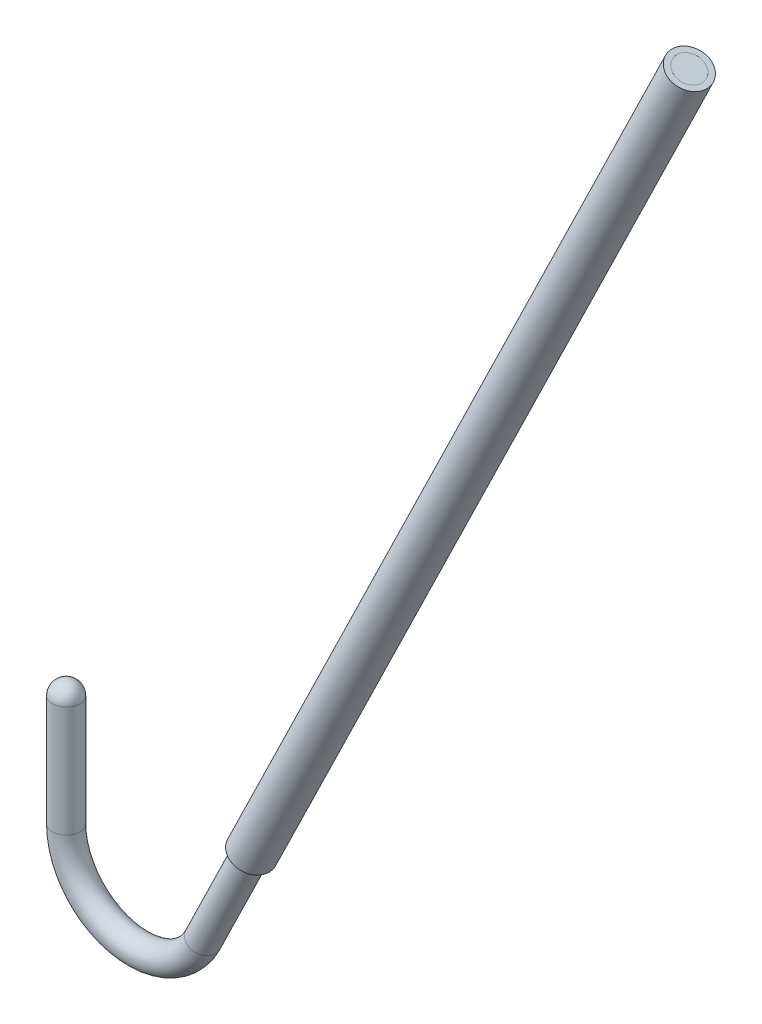
ISO-10303-21;
HEADER;
FILE_DESCRIPTION(('STEP AP214'),'2;1');
FILE_NAME('part.step','',(''),(''),'','','');
FILE_SCHEMA(('AUTOMOTIVE_DESIGN { 1 0 10303 214 1 1 1 1 }'));
ENDSEC;
DATA;
#1=APPLICATION_CONTEXT('core data for automotive mechanical design processes');
#2=APPLICATION_PROTOCOL_DEFINITION('international standard','automotive_design',2000,#1);
#3=PRODUCT_CONTEXT('',#1,'mechanical');
#4=PRODUCT('Part','Part','',(#3));
#5=PRODUCT_RELATED_PRODUCT_CATEGORY('part','',(#4));
#6=PRODUCT_DEFINITION_FORMATION('','',#4);
#7=PRODUCT_DEFINITION_CONTEXT('part definition',#1,'design');
#8=PRODUCT_DEFINITION('design','',#6,#7);
#9=PRODUCT_DEFINITION_SHAPE('','',#8);
#10=(LENGTH_UNIT() NAMED_UNIT(*) SI_UNIT(.MILLI.,.METRE.));
#11=(NAMED_UNIT(*) PLANE_ANGLE_UNIT() SI_UNIT($,.RADIAN.));
#12=(NAMED_UNIT(*) SI_UNIT($,.STERADIAN.) SOLID_ANGLE_UNIT());
#13=UNCERTAINTY_MEASURE_WITH_UNIT(LENGTH_MEASURE(1.E-05),#10,'distance_accuracy_value','');
#14=(GEOMETRIC_REPRESENTATION_CONTEXT(3) GLOBAL_UNCERTAINTY_ASSIGNED_CONTEXT((#13)) GLOBAL_UNIT_ASSIGNED_CONTEXT((#10,
#11,#12)) REPRESENTATION_CONTEXT('',''));
#15=CARTESIAN_POINT('',(0.,0.,0.));
#16=DIRECTION('',(0.,0.,1.));
#17=DIRECTION('',(1.,0.,0.));
#18=AXIS2_PLACEMENT_3D('',#15,#16,#17);
#19=CARTESIAN_POINT('',(3.34517455376707,-0.772294398227437,0.));
#20=DIRECTION('',(0.438371146789072,0.89879404629917,0.));
#21=DIRECTION('',(-0.89879404629917,0.438371146789072,0.));
#22=AXIS2_PLACEMENT_3D('',#19,#20,#21);
#23=CYLINDRICAL_SURFACE('',#22,0.35);
#24=CARTESIAN_POINT('',(3.34517455376707,-0.772294398227437,0.));
#25=DIRECTION('',(0.438371146789072,0.89879404629917,0.));
#26=DIRECTION('',(-0.89879404629917,0.438371146789072,0.));
#27=AXIS2_PLACEMENT_3D('',#24,#25,#26);
#28=CIRCLE('',#27,0.35);
#29=CARTESIAN_POINT('',(3.03059663756236,-0.618864496851262,0.));
#30=VERTEX_POINT('',#29);
#31=EDGE_CURVE('E11',#30,#30,#28,.T.);
#32=ORIENTED_EDGE('',*,*,#31,.T.);
#33=EDGE_LOOP('',(#32));
#34=FACE_BOUND('',#33,.T.);
#35=CARTESIAN_POINT('',(11.2358551959704,15.4059984351576,0.));
#36=DIRECTION('',(0.438371146789072,0.89879404629917,0.));
#37=DIRECTION('',(-0.89879404629917,0.438371146789072,0.));
#38=AXIS2_PLACEMENT_3D('',#35,#36,#37);
#39=CIRCLE('',#38,0.35);
#40=CARTESIAN_POINT('',(10.9212772797657,15.5594283365338,0.));
#41=VERTEX_POINT('',#40);
#42=EDGE_CURVE('E45',#41,#41,#39,.T.);
#43=ORIENTED_EDGE('',*,*,#42,.F.);
#44=EDGE_LOOP('',(#43));
#45=FACE_BOUND('',#44,.T.);
#46=ADVANCED_FACE('F42',(#34,#45),#23,.T.);
#47=CARTESIAN_POINT('',(3.34517455376707,-0.772294398227437,0.));
#48=DIRECTION('',(0.438371146789072,0.89879404629917,0.));
#49=DIRECTION('',(-0.89879404629917,0.438371146789072,0.));
#50=AXIS2_PLACEMENT_3D('',#47,#48,#49);
#51=PLANE('',#50);
#52=CARTESIAN_POINT('',(3.34517455376707,-0.772294398227437,0.));
#53=DIRECTION('',(0.438371146789072,0.89879404629917,0.));
#54=DIRECTION('',(-0.89879404629917,0.438371146789072,0.));
#55=AXIS2_PLACEMENT_3D('',#52,#53,#54);
#56=CIRCLE('',#55,0.250000000000001);
#57=CARTESIAN_POINT('',(3.12047604219228,-0.662701611530168,0.));
#58=VERTEX_POINT('',#57);
#59=EDGE_CURVE('E54',#58,#58,#56,.T.);
#60=ORIENTED_EDGE('',*,*,#59,.T.);
#61=EDGE_LOOP('',(#60));
#62=FACE_BOUND('',#61,.T.);
#63=ORIENTED_EDGE('',*,*,#31,.F.);
#64=EDGE_LOOP('',(#63));
#65=FACE_BOUND('',#64,.T.);
#66=ADVANCED_FACE('F64',(#62,#65),#51,.F.);
#67=CARTESIAN_POINT('',(11.2358551959704,15.4059984351576,0.));
#68=DIRECTION('',(0.438371146789072,0.89879404629917,0.));
#69=DIRECTION('',(-0.89879404629917,0.438371146789072,0.));
#70=AXIS2_PLACEMENT_3D('',#67,#68,#69);
#71=PLANE('',#70);
#72=CARTESIAN_POINT('',(11.2358551959704,15.4059984351576,0.));
#73=DIRECTION('',(0.438371146789072,0.89879404629917,0.));
#74=DIRECTION('',(-0.89879404629917,0.438371146789072,0.));
#75=AXIS2_PLACEMENT_3D('',#72,#73,#74);
#76=CIRCLE('',#75,0.250000000000001);
#77=CARTESIAN_POINT('',(11.0111566843956,15.5155912218549,0.));
#78=VERTEX_POINT('',#77);
#79=EDGE_CURVE('E56',#78,#78,#76,.T.);
#80=ORIENTED_EDGE('',*,*,#79,.F.);
#81=EDGE_LOOP('',(#80));
#82=FACE_BOUND('',#81,.T.);
#83=ORIENTED_EDGE('',*,*,#42,.T.);
#84=EDGE_LOOP('',(#83));
#85=FACE_BOUND('',#84,.T.);
#86=ADVANCED_FACE('F70',(#82,#85),#71,.T.);
#87=CARTESIAN_POINT('',(3.34517455376707,-0.772294398227437,0.));
#88=DIRECTION('',(0.438371146789072,0.89879404629917,0.));
#89=DIRECTION('',(-0.89879404629917,0.438371146789072,0.));
#90=AXIS2_PLACEMENT_3D('',#87,#88,#89);
#91=CYLINDRICAL_SURFACE('',#90,0.250000000000001);
#92=ORIENTED_EDGE('',*,*,#59,.F.);
#93=EDGE_LOOP('',(#92));
#94=FACE_BOUND('',#93,.T.);
#95=ORIENTED_EDGE('',*,*,#79,.T.);
#96=EDGE_LOOP('',(#95));
#97=FACE_BOUND('',#96,.T.);
#98=ADVANCED_FACE('F67',(#94,#97),#91,.F.);
#99=CLOSED_SHELL('',(#46,#66,#86,#98));
#100=MANIFOLD_SOLID_BREP('B2',#99);
#101=CARTESIAN_POINT('',(11.2358551959704,15.4059984351576,0.));
#102=DIRECTION('',(-0.438371146789072,-0.89879404629917,0.));
#103=DIRECTION('',(0.,0.,1.));
#104=AXIS2_PLACEMENT_3D('',#101,#102,#103);
#105=PLANE('',#104);
#106=CARTESIAN_POINT('',(11.2358551959704,15.4059984351576,0.));
#107=DIRECTION('',(-0.438371146789072,-0.89879404629917,0.));
#108=DIRECTION('',(0.,0.,1.));
#109=AXIS2_PLACEMENT_3D('',#106,#107,#108);
#110=CIRCLE('',#109,0.25);
#111=CARTESIAN_POINT('',(11.2358551959704,15.4059984351576,0.25));
#112=VERTEX_POINT('',#111);
#113=EDGE_CURVE('E41',#112,#112,#110,.T.);
#114=ORIENTED_EDGE('',*,*,#113,.F.);
#115=EDGE_LOOP('',(#114));
#116=FACE_BOUND('',#115,.T.);
#117=ADVANCED_FACE('F111',(#116),#105,.F.);
#118=CARTESIAN_POINT('',(0.,0.,0.));
#119=DIRECTION('',(0.,-1.,0.));
#120=DIRECTION('',(1.,0.,0.));
#121=AXIS2_PLACEMENT_3D('',#118,#119,#120);
#122=CYLINDRICAL_SURFACE('',#121,0.25);
#123=CARTESIAN_POINT('',(0.,-2.,0.));
#124=DIRECTION('',(0.,1.,0.));
#125=DIRECTION('',(0.,0.,1.));
#126=AXIS2_PLACEMENT_3D('',#123,#124,#125);
#127=CIRCLE('',#126,0.25);
#128=CARTESIAN_POINT('',(-0.25,-2.,0.));
#129=VERTEX_POINT('',#128);
#130=EDGE_CURVE('E125',#129,#129,#127,.T.);
#131=ORIENTED_EDGE('',*,*,#130,.T.);
#132=EDGE_LOOP('',(#131));
#133=FACE_BOUND('',#132,.T.);
#134=CARTESIAN_POINT('',(0.,0.,0.));
#135=DIRECTION('',(0.,1.,0.));
#136=DIRECTION('',(0.,0.,1.));
#137=AXIS2_PLACEMENT_3D('',#134,#135,#136);
#138=CIRCLE('',#137,0.25);
#139=CARTESIAN_POINT('',(0.,0.,0.25));
#140=VERTEX_POINT('',#139);
#141=EDGE_CURVE('E129',#140,#140,#138,.T.);
#142=ORIENTED_EDGE('',*,*,#141,.F.);
#143=EDGE_LOOP('',(#142));
#144=FACE_BOUND('',#143,.T.);
#145=ADVANCED_FACE('F137',(#133,#144),#122,.T.);
#146=CARTESIAN_POINT('',(1.3,-2.,0.));
#147=DIRECTION('',(0.,0.,1.));
#148=DIRECTION('',(1.,0.,0.));
#149=AXIS2_PLACEMENT_3D('',#146,#147,#148);
#150=TOROIDAL_SURFACE('',#149,1.3,0.25);
#151=CARTESIAN_POINT('',(2.46843226018892,-2.56988249082579,0.));
#152=DIRECTION('',(-0.438371146789072,-0.89879404629917,0.));
#153=DIRECTION('',(0.,0.,1.));
#154=AXIS2_PLACEMENT_3D('',#151,#152,#153);
#155=CIRCLE('',#154,0.25);
#156=CARTESIAN_POINT('',(2.69313077176371,-2.67947527752306,0.));
#157=VERTEX_POINT('',#156);
#158=EDGE_CURVE('E118',#157,#157,#155,.T.);
#159=CARTESIAN_POINT('',(1.3,-2.,0.));
#160=DIRECTION('',(0.,0.,1.));
#161=DIRECTION('',(1.,0.,0.));
#162=AXIS2_PLACEMENT_3D('',#159,#160,#161);
#163=CIRCLE('',#162,1.55);
#164=EDGE_CURVE('',#129,#157,#163,.T.);
#165=ORIENTED_EDGE('',*,*,#130,.F.);
#166=ORIENTED_EDGE('',*,*,#158,.T.);
#167=ORIENTED_EDGE('',*,*,#164,.T.);
#168=ORIENTED_EDGE('',*,*,#164,.F.);
#169=EDGE_LOOP('',(#165,#167,#166,#168));
#170=FACE_BOUND('',#169,.T.);
#171=ADVANCED_FACE('F139',(#170),#150,.T.);
#172=CARTESIAN_POINT('',(2.46843226018892,-2.56988249082579,0.));
#173=DIRECTION('',(0.438371146789072,0.89879404629917,0.));
#174=DIRECTION('',(-0.89879404629917,0.438371146789072,0.));
#175=AXIS2_PLACEMENT_3D('',#172,#173,#174);
#176=CYLINDRICAL_SURFACE('',#175,0.25);
#177=ORIENTED_EDGE('',*,*,#113,.T.);
#178=EDGE_LOOP('',(#177));
#179=FACE_BOUND('',#178,.T.);
#180=ORIENTED_EDGE('',*,*,#158,.F.);
#181=EDGE_LOOP('',(#180));
#182=FACE_BOUND('',#181,.T.);
#183=ADVANCED_FACE('F145',(#179,#182),#176,.T.);
#184=CARTESIAN_POINT('',(0.,0.,0.));
#185=DIRECTION('',(0.,-1.,0.));
#186=DIRECTION('',(0.,0.,1.));
#187=AXIS2_PLACEMENT_3D('',#184,#185,#186);
#188=SPHERICAL_SURFACE('',#187,0.25);
#189=ORIENTED_EDGE('',*,*,#141,.T.);
#190=EDGE_LOOP('',(#189));
#191=FACE_BOUND('',#190,.T.);
#192=ADVANCED_FACE('F135',(#191),#188,.T.);
#193=CLOSED_SHELL('',(#117,#145,#171,#183,#192));
#194=MANIFOLD_SOLID_BREP('B6',#193);
#195=ADVANCED_BREP_SHAPE_REPRESENTATION('',(#18,#100,#194),#14);
#196=SHAPE_DEFINITION_REPRESENTATION(#9,#195);
ENDSEC;
END-ISO-10303-21;
